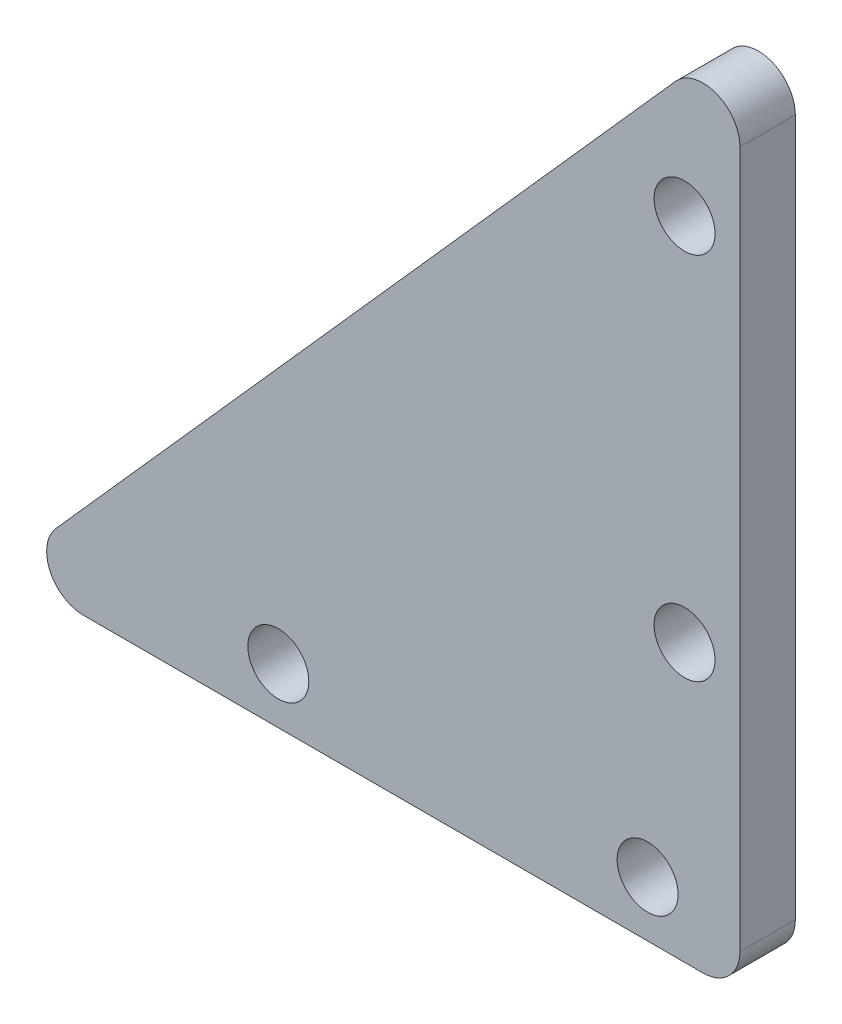
ISO-10303-21;
HEADER;
FILE_DESCRIPTION(('STEP AP214'),'2;1');
FILE_NAME('part.step','',(''),(''),'','','');
FILE_SCHEMA(('AUTOMOTIVE_DESIGN { 1 0 10303 214 1 1 1 1 }'));
ENDSEC;
DATA;
#1=APPLICATION_CONTEXT('core data for automotive mechanical design processes');
#2=APPLICATION_PROTOCOL_DEFINITION('international standard','automotive_design',2000,#1);
#3=PRODUCT_CONTEXT('',#1,'mechanical');
#4=PRODUCT('Part','Part','',(#3));
#5=PRODUCT_RELATED_PRODUCT_CATEGORY('part','',(#4));
#6=PRODUCT_DEFINITION_FORMATION('','',#4);
#7=PRODUCT_DEFINITION_CONTEXT('part definition',#1,'design');
#8=PRODUCT_DEFINITION('design','',#6,#7);
#9=PRODUCT_DEFINITION_SHAPE('','',#8);
#10=(LENGTH_UNIT() NAMED_UNIT(*) SI_UNIT(.MILLI.,.METRE.));
#11=(NAMED_UNIT(*) PLANE_ANGLE_UNIT() SI_UNIT($,.RADIAN.));
#12=(NAMED_UNIT(*) SI_UNIT($,.STERADIAN.) SOLID_ANGLE_UNIT());
#13=UNCERTAINTY_MEASURE_WITH_UNIT(LENGTH_MEASURE(1.E-05),#10,'distance_accuracy_value','');
#14=(GEOMETRIC_REPRESENTATION_CONTEXT(3) GLOBAL_UNCERTAINTY_ASSIGNED_CONTEXT((#13)) GLOBAL_UNIT_ASSIGNED_CONTEXT((#10,
#11,#12)) REPRESENTATION_CONTEXT('',''));
#15=CARTESIAN_POINT('',(0.,0.,0.));
#16=DIRECTION('',(0.,0.,1.));
#17=DIRECTION('',(1.,0.,0.));
#18=AXIS2_PLACEMENT_3D('',#15,#16,#17);
#19=CARTESIAN_POINT('',(0.,45.,3.));
#20=DIRECTION('',(-1.,0.,0.));
#21=DIRECTION('',(0.,-1.,0.));
#22=AXIS2_PLACEMENT_3D('',#19,#20,#21);
#23=PLANE('',#22);
#24=DIRECTION('',(0.,1.,0.));
#25=VECTOR('',#24,1.);
#26=CARTESIAN_POINT('',(0.,45.,3.));
#27=LINE('',#26,#25);
#28=CARTESIAN_POINT('',(0.,2.00000000000002,3.));
#29=VERTEX_POINT('',#28);
#30=CARTESIAN_POINT('',(0.,39.7396013553019,3.));
#31=VERTEX_POINT('',#30);
#32=EDGE_CURVE('E112',#29,#31,#27,.T.);
#33=ORIENTED_EDGE('',*,*,#32,.F.);
#34=DIRECTION('',(0.,0.,-1.));
#35=VECTOR('',#34,1.);
#36=CARTESIAN_POINT('',(0.,2.,3.));
#37=LINE('',#36,#35);
#38=CARTESIAN_POINT('',(0.,2.00000000000002,0.));
#39=VERTEX_POINT('',#38);
#40=EDGE_CURVE('E98',#29,#39,#37,.T.);
#41=ORIENTED_EDGE('',*,*,#40,.T.);
#42=DIRECTION('',(0.,1.,0.));
#43=VECTOR('',#42,1.);
#44=CARTESIAN_POINT('',(0.,45.,0.));
#45=LINE('',#44,#43);
#46=CARTESIAN_POINT('',(0.,39.7396013553019,0.));
#47=VERTEX_POINT('',#46);
#48=EDGE_CURVE('E110',#39,#47,#45,.T.);
#49=ORIENTED_EDGE('',*,*,#48,.T.);
#50=DIRECTION('',(0.,0.,-1.));
#51=VECTOR('',#50,1.);
#52=CARTESIAN_POINT('',(0.,39.7396013553019,3.));
#53=LINE('',#52,#51);
#54=EDGE_CURVE('E114',#47,#31,#53,.F.);
#55=ORIENTED_EDGE('',*,*,#54,.T.);
#56=EDGE_LOOP('',(#33,#41,#49,#55));
#57=FACE_BOUND('',#56,.T.);
#58=ADVANCED_FACE('F41',(#57),#23,.F.);
#59=CARTESIAN_POINT('',(-40.,0.,3.));
#60=DIRECTION('',(0.74740931868366,-0.66436383882992,0.));
#61=DIRECTION('',(0.66436383882992,0.74740931868366,0.));
#62=AXIS2_PLACEMENT_3D('',#59,#60,#61);
#63=PLANE('',#62);
#64=DIRECTION('',(-0.66436383882992,-0.74740931868366,0.));
#65=VECTOR('',#64,1.);
#66=CARTESIAN_POINT('',(-40.,0.,0.));
#67=LINE('',#66,#65);
#68=CARTESIAN_POINT('',(-3.49481863736732,41.0683290329618,0.));
#69=VERTEX_POINT('',#68);
#70=CARTESIAN_POINT('',(-37.0411309531913,3.32872767765984,0.));
#71=VERTEX_POINT('',#70);
#72=EDGE_CURVE('E118',#69,#71,#67,.T.);
#73=ORIENTED_EDGE('',*,*,#72,.T.);
#74=DIRECTION('',(0.,0.,-1.));
#75=VECTOR('',#74,1.);
#76=CARTESIAN_POINT('',(-37.0411309531913,3.32872767765984,3.));
#77=LINE('',#76,#75);
#78=CARTESIAN_POINT('',(-37.0411309531913,3.32872767765984,3.));
#79=VERTEX_POINT('',#78);
#80=EDGE_CURVE('E11',#71,#79,#77,.F.);
#81=ORIENTED_EDGE('',*,*,#80,.T.);
#82=DIRECTION('',(-0.66436383882992,-0.74740931868366,0.));
#83=VECTOR('',#82,1.);
#84=CARTESIAN_POINT('',(-40.,0.,3.));
#85=LINE('',#84,#83);
#86=CARTESIAN_POINT('',(-3.49481863736732,41.0683290329618,3.));
#87=VERTEX_POINT('',#86);
#88=EDGE_CURVE('E144',#87,#79,#85,.T.);
#89=ORIENTED_EDGE('',*,*,#88,.F.);
#90=DIRECTION('',(0.,0.,-1.));
#91=VECTOR('',#90,1.);
#92=CARTESIAN_POINT('',(-3.49481863736732,41.0683290329618,3.));
#93=LINE('',#92,#91);
#94=EDGE_CURVE('E49',#87,#69,#93,.T.);
#95=ORIENTED_EDGE('',*,*,#94,.T.);
#96=EDGE_LOOP('',(#73,#81,#89,#95));
#97=FACE_BOUND('',#96,.T.);
#98=ADVANCED_FACE('F143',(#97),#63,.F.);
#99=CARTESIAN_POINT('',(0.,0.,3.));
#100=DIRECTION('',(0.,1.,0.));
#101=DIRECTION('',(-1.,0.,0.));
#102=AXIS2_PLACEMENT_3D('',#99,#100,#101);
#103=PLANE('',#102);
#104=DIRECTION('',(1.,0.,0.));
#105=VECTOR('',#104,1.);
#106=CARTESIAN_POINT('',(0.,0.,0.));
#107=LINE('',#106,#105);
#108=CARTESIAN_POINT('',(-35.5463123158239,0.,0.));
#109=VERTEX_POINT('',#108);
#110=CARTESIAN_POINT('',(-2.,0.,0.));
#111=VERTEX_POINT('',#110);
#112=EDGE_CURVE('E121',#109,#111,#107,.T.);
#113=ORIENTED_EDGE('',*,*,#112,.T.);
#114=DIRECTION('',(0.,0.,-1.));
#115=VECTOR('',#114,1.);
#116=CARTESIAN_POINT('',(-2.,0.,3.));
#117=LINE('',#116,#115);
#118=CARTESIAN_POINT('',(-2.,0.,3.));
#119=VERTEX_POINT('',#118);
#120=EDGE_CURVE('E99',#111,#119,#117,.F.);
#121=ORIENTED_EDGE('',*,*,#120,.T.);
#122=DIRECTION('',(1.,0.,0.));
#123=VECTOR('',#122,1.);
#124=CARTESIAN_POINT('',(0.,0.,3.));
#125=LINE('',#124,#123);
#126=CARTESIAN_POINT('',(-35.5463123158239,0.,3.));
#127=VERTEX_POINT('',#126);
#128=EDGE_CURVE('E127',#127,#119,#125,.T.);
#129=ORIENTED_EDGE('',*,*,#128,.F.);
#130=DIRECTION('',(0.,0.,-1.));
#131=VECTOR('',#130,1.);
#132=CARTESIAN_POINT('',(-35.5463123158239,0.,3.));
#133=LINE('',#132,#131);
#134=EDGE_CURVE('E104',#127,#109,#133,.T.);
#135=ORIENTED_EDGE('',*,*,#134,.T.);
#136=EDGE_LOOP('',(#113,#121,#129,#135));
#137=FACE_BOUND('',#136,.T.);
#138=ADVANCED_FACE('F152',(#137),#103,.F.);
#139=CARTESIAN_POINT('',(0.,0.,3.));
#140=DIRECTION('',(0.,0.,-1.));
#141=DIRECTION('',(-1.,0.,0.));
#142=AXIS2_PLACEMENT_3D('',#139,#140,#141);
#143=PLANE('',#142);
#144=CARTESIAN_POINT('',(-3.,15.,3.));
#145=DIRECTION('',(0.,0.,1.));
#146=DIRECTION('',(1.,0.,0.));
#147=AXIS2_PLACEMENT_3D('',#144,#145,#146);
#148=CIRCLE('',#147,1.65);
#149=CARTESIAN_POINT('',(-1.35,15.,3.));
#150=VERTEX_POINT('',#149);
#151=EDGE_CURVE('E171',#150,#150,#148,.T.);
#152=ORIENTED_EDGE('',*,*,#151,.F.);
#153=EDGE_LOOP('',(#152));
#154=FACE_BOUND('',#153,.T.);
#155=CARTESIAN_POINT('',(-3.,35.,3.));
#156=DIRECTION('',(0.,0.,1.));
#157=DIRECTION('',(1.,0.,0.));
#158=AXIS2_PLACEMENT_3D('',#155,#156,#157);
#159=CIRCLE('',#158,1.65);
#160=CARTESIAN_POINT('',(-1.35,35.,3.));
#161=VERTEX_POINT('',#160);
#162=EDGE_CURVE('E168',#161,#161,#159,.T.);
#163=ORIENTED_EDGE('',*,*,#162,.F.);
#164=EDGE_LOOP('',(#163));
#165=FACE_BOUND('',#164,.T.);
#166=CARTESIAN_POINT('',(-5.,3.,3.));
#167=DIRECTION('',(0.,0.,1.));
#168=DIRECTION('',(1.,0.,0.));
#169=AXIS2_PLACEMENT_3D('',#166,#167,#168);
#170=CIRCLE('',#169,1.65);
#171=CARTESIAN_POINT('',(-3.35,3.,3.));
#172=VERTEX_POINT('',#171);
#173=EDGE_CURVE('E124',#172,#172,#170,.T.);
#174=ORIENTED_EDGE('',*,*,#173,.F.);
#175=EDGE_LOOP('',(#174));
#176=FACE_BOUND('',#175,.T.);
#177=CARTESIAN_POINT('',(-25.,3.,3.));
#178=DIRECTION('',(0.,0.,1.));
#179=DIRECTION('',(1.,0.,0.));
#180=AXIS2_PLACEMENT_3D('',#177,#178,#179);
#181=CIRCLE('',#180,1.65);
#182=CARTESIAN_POINT('',(-23.35,3.,3.));
#183=VERTEX_POINT('',#182);
#184=EDGE_CURVE('E159',#183,#183,#181,.T.);
#185=ORIENTED_EDGE('',*,*,#184,.F.);
#186=EDGE_LOOP('',(#185));
#187=FACE_BOUND('',#186,.T.);
#188=ORIENTED_EDGE('',*,*,#128,.T.);
#189=CARTESIAN_POINT('',(-2.,2.,3.));
#190=DIRECTION('',(0.,0.,-1.));
#191=DIRECTION('',(-1.,0.,0.));
#192=AXIS2_PLACEMENT_3D('',#189,#190,#191);
#193=CIRCLE('',#192,2.);
#194=EDGE_CURVE('E140',#119,#29,#193,.F.);
#195=ORIENTED_EDGE('',*,*,#194,.T.);
#196=ORIENTED_EDGE('',*,*,#32,.T.);
#197=CARTESIAN_POINT('',(-2.,39.7396013553019,3.));
#198=DIRECTION('',(0.,0.,-1.));
#199=DIRECTION('',(-1.,0.,0.));
#200=AXIS2_PLACEMENT_3D('',#197,#198,#199);
#201=CIRCLE('',#200,2.);
#202=EDGE_CURVE('E61',#31,#87,#201,.F.);
#203=ORIENTED_EDGE('',*,*,#202,.T.);
#204=ORIENTED_EDGE('',*,*,#88,.T.);
#205=CARTESIAN_POINT('',(-35.5463123158239,2.,3.));
#206=DIRECTION('',(0.,0.,-1.));
#207=DIRECTION('',(-1.,0.,0.));
#208=AXIS2_PLACEMENT_3D('',#205,#206,#207);
#209=CIRCLE('',#208,2.);
#210=EDGE_CURVE('E138',#79,#127,#209,.F.);
#211=ORIENTED_EDGE('',*,*,#210,.T.);
#212=EDGE_LOOP('',(#188,#195,#196,#203,#204,#211));
#213=FACE_BOUND('',#212,.T.);
#214=ADVANCED_FACE('F186',(#154,#165,#176,#187,#213),#143,.F.);
#215=CARTESIAN_POINT('',(0.,0.,0.));
#216=DIRECTION('',(0.,0.,-1.));
#217=DIRECTION('',(-1.,0.,0.));
#218=AXIS2_PLACEMENT_3D('',#215,#216,#217);
#219=PLANE('',#218);
#220=CARTESIAN_POINT('',(-3.,15.,0.));
#221=DIRECTION('',(0.,0.,1.));
#222=DIRECTION('',(1.,0.,0.));
#223=AXIS2_PLACEMENT_3D('',#220,#221,#222);
#224=CIRCLE('',#223,1.65);
#225=CARTESIAN_POINT('',(-1.35,15.,0.));
#226=VERTEX_POINT('',#225);
#227=EDGE_CURVE('E160',#226,#226,#224,.T.);
#228=ORIENTED_EDGE('',*,*,#227,.T.);
#229=EDGE_LOOP('',(#228));
#230=FACE_BOUND('',#229,.T.);
#231=CARTESIAN_POINT('',(-3.,35.,0.));
#232=DIRECTION('',(0.,0.,1.));
#233=DIRECTION('',(1.,0.,0.));
#234=AXIS2_PLACEMENT_3D('',#231,#232,#233);
#235=CIRCLE('',#234,1.65);
#236=CARTESIAN_POINT('',(-1.35,35.,0.));
#237=VERTEX_POINT('',#236);
#238=EDGE_CURVE('E165',#237,#237,#235,.T.);
#239=ORIENTED_EDGE('',*,*,#238,.T.);
#240=EDGE_LOOP('',(#239));
#241=FACE_BOUND('',#240,.T.);
#242=CARTESIAN_POINT('',(-5.,3.,0.));
#243=DIRECTION('',(0.,0.,1.));
#244=DIRECTION('',(1.,0.,0.));
#245=AXIS2_PLACEMENT_3D('',#242,#243,#244);
#246=CIRCLE('',#245,1.65);
#247=CARTESIAN_POINT('',(-3.35,3.,0.));
#248=VERTEX_POINT('',#247);
#249=EDGE_CURVE('E119',#248,#248,#246,.T.);
#250=ORIENTED_EDGE('',*,*,#249,.T.);
#251=EDGE_LOOP('',(#250));
#252=FACE_BOUND('',#251,.T.);
#253=CARTESIAN_POINT('',(-25.,3.,0.));
#254=DIRECTION('',(0.,0.,1.));
#255=DIRECTION('',(1.,0.,0.));
#256=AXIS2_PLACEMENT_3D('',#253,#254,#255);
#257=CIRCLE('',#256,1.65);
#258=CARTESIAN_POINT('',(-23.35,3.,0.));
#259=VERTEX_POINT('',#258);
#260=EDGE_CURVE('E156',#259,#259,#257,.T.);
#261=ORIENTED_EDGE('',*,*,#260,.T.);
#262=EDGE_LOOP('',(#261));
#263=FACE_BOUND('',#262,.T.);
#264=ORIENTED_EDGE('',*,*,#48,.F.);
#265=CARTESIAN_POINT('',(-2.,2.,0.));
#266=DIRECTION('',(0.,0.,-1.));
#267=DIRECTION('',(-1.,0.,0.));
#268=AXIS2_PLACEMENT_3D('',#265,#266,#267);
#269=CIRCLE('',#268,2.);
#270=EDGE_CURVE('E94',#39,#111,#269,.T.);
#271=ORIENTED_EDGE('',*,*,#270,.T.);
#272=ORIENTED_EDGE('',*,*,#112,.F.);
#273=CARTESIAN_POINT('',(-35.5463123158239,2.,0.));
#274=DIRECTION('',(0.,0.,-1.));
#275=DIRECTION('',(-1.,0.,0.));
#276=AXIS2_PLACEMENT_3D('',#273,#274,#275);
#277=CIRCLE('',#276,2.);
#278=EDGE_CURVE('E105',#109,#71,#277,.T.);
#279=ORIENTED_EDGE('',*,*,#278,.T.);
#280=ORIENTED_EDGE('',*,*,#72,.F.);
#281=CARTESIAN_POINT('',(-2.,39.7396013553019,0.));
#282=DIRECTION('',(0.,0.,-1.));
#283=DIRECTION('',(-1.,0.,0.));
#284=AXIS2_PLACEMENT_3D('',#281,#282,#283);
#285=CIRCLE('',#284,2.);
#286=EDGE_CURVE('E113',#69,#47,#285,.T.);
#287=ORIENTED_EDGE('',*,*,#286,.T.);
#288=EDGE_LOOP('',(#264,#271,#272,#279,#280,#287));
#289=FACE_BOUND('',#288,.T.);
#290=ADVANCED_FACE('F116',(#230,#241,#252,#263,#289),#219,.T.);
#291=CARTESIAN_POINT('',(-25.,3.,0.));
#292=DIRECTION('',(0.,0.,1.));
#293=DIRECTION('',(1.,0.,0.));
#294=AXIS2_PLACEMENT_3D('',#291,#292,#293);
#295=CYLINDRICAL_SURFACE('',#294,1.65);
#296=ORIENTED_EDGE('',*,*,#260,.F.);
#297=EDGE_LOOP('',(#296));
#298=FACE_BOUND('',#297,.T.);
#299=ORIENTED_EDGE('',*,*,#184,.T.);
#300=EDGE_LOOP('',(#299));
#301=FACE_BOUND('',#300,.T.);
#302=ADVANCED_FACE('F196',(#298,#301),#295,.F.);
#303=CARTESIAN_POINT('',(-5.,3.,0.));
#304=DIRECTION('',(0.,0.,1.));
#305=DIRECTION('',(1.,0.,0.));
#306=AXIS2_PLACEMENT_3D('',#303,#304,#305);
#307=CYLINDRICAL_SURFACE('',#306,1.65);
#308=ORIENTED_EDGE('',*,*,#249,.F.);
#309=EDGE_LOOP('',(#308));
#310=FACE_BOUND('',#309,.T.);
#311=ORIENTED_EDGE('',*,*,#173,.T.);
#312=EDGE_LOOP('',(#311));
#313=FACE_BOUND('',#312,.T.);
#314=ADVANCED_FACE('F198',(#310,#313),#307,.F.);
#315=CARTESIAN_POINT('',(-3.,35.,0.));
#316=DIRECTION('',(0.,0.,1.));
#317=DIRECTION('',(1.,0.,0.));
#318=AXIS2_PLACEMENT_3D('',#315,#316,#317);
#319=CYLINDRICAL_SURFACE('',#318,1.65);
#320=ORIENTED_EDGE('',*,*,#238,.F.);
#321=EDGE_LOOP('',(#320));
#322=FACE_BOUND('',#321,.T.);
#323=ORIENTED_EDGE('',*,*,#162,.T.);
#324=EDGE_LOOP('',(#323));
#325=FACE_BOUND('',#324,.T.);
#326=ADVANCED_FACE('F182',(#322,#325),#319,.F.);
#327=CARTESIAN_POINT('',(-3.,15.,0.));
#328=DIRECTION('',(0.,0.,1.));
#329=DIRECTION('',(1.,0.,0.));
#330=AXIS2_PLACEMENT_3D('',#327,#328,#329);
#331=CYLINDRICAL_SURFACE('',#330,1.65);
#332=ORIENTED_EDGE('',*,*,#227,.F.);
#333=EDGE_LOOP('',(#332));
#334=FACE_BOUND('',#333,.T.);
#335=ORIENTED_EDGE('',*,*,#151,.T.);
#336=EDGE_LOOP('',(#335));
#337=FACE_BOUND('',#336,.T.);
#338=ADVANCED_FACE('F179',(#334,#337),#331,.F.);
#339=CARTESIAN_POINT('',(-2.,2.,3.));
#340=DIRECTION('',(0.,0.,-1.));
#341=DIRECTION('',(-1.,0.,0.));
#342=AXIS2_PLACEMENT_3D('',#339,#340,#341);
#343=CYLINDRICAL_SURFACE('',#342,2.);
#344=ORIENTED_EDGE('',*,*,#194,.F.);
#345=ORIENTED_EDGE('',*,*,#120,.F.);
#346=ORIENTED_EDGE('',*,*,#270,.F.);
#347=ORIENTED_EDGE('',*,*,#40,.F.);
#348=EDGE_LOOP('',(#344,#345,#346,#347));
#349=FACE_BOUND('',#348,.T.);
#350=ADVANCED_FACE('F97',(#349),#343,.T.);
#351=CARTESIAN_POINT('',(-35.5463123158239,2.,3.));
#352=DIRECTION('',(0.,0.,-1.));
#353=DIRECTION('',(-1.,0.,0.));
#354=AXIS2_PLACEMENT_3D('',#351,#352,#353);
#355=CYLINDRICAL_SURFACE('',#354,2.);
#356=ORIENTED_EDGE('',*,*,#210,.F.);
#357=ORIENTED_EDGE('',*,*,#80,.F.);
#358=ORIENTED_EDGE('',*,*,#278,.F.);
#359=ORIENTED_EDGE('',*,*,#134,.F.);
#360=EDGE_LOOP('',(#356,#357,#358,#359));
#361=FACE_BOUND('',#360,.T.);
#362=ADVANCED_FACE('F149',(#361),#355,.T.);
#363=CARTESIAN_POINT('',(-2.,39.7396013553019,3.));
#364=DIRECTION('',(0.,0.,-1.));
#365=DIRECTION('',(-1.,0.,0.));
#366=AXIS2_PLACEMENT_3D('',#363,#364,#365);
#367=CYLINDRICAL_SURFACE('',#366,2.);
#368=ORIENTED_EDGE('',*,*,#202,.F.);
#369=ORIENTED_EDGE('',*,*,#54,.F.);
#370=ORIENTED_EDGE('',*,*,#286,.F.);
#371=ORIENTED_EDGE('',*,*,#94,.F.);
#372=EDGE_LOOP('',(#368,#369,#370,#371));
#373=FACE_BOUND('',#372,.T.);
#374=ADVANCED_FACE('F43',(#373),#367,.T.);
#375=CLOSED_SHELL('',(#58,#98,#138,#214,#290,#302,#314,#326,#338,#350,#362,#374));
#376=MANIFOLD_SOLID_BREP('B2',#375);
#377=ADVANCED_BREP_SHAPE_REPRESENTATION('',(#18,#376),#14);
#378=SHAPE_DEFINITION_REPRESENTATION(#9,#377);
ENDSEC;
END-ISO-10303-21;
